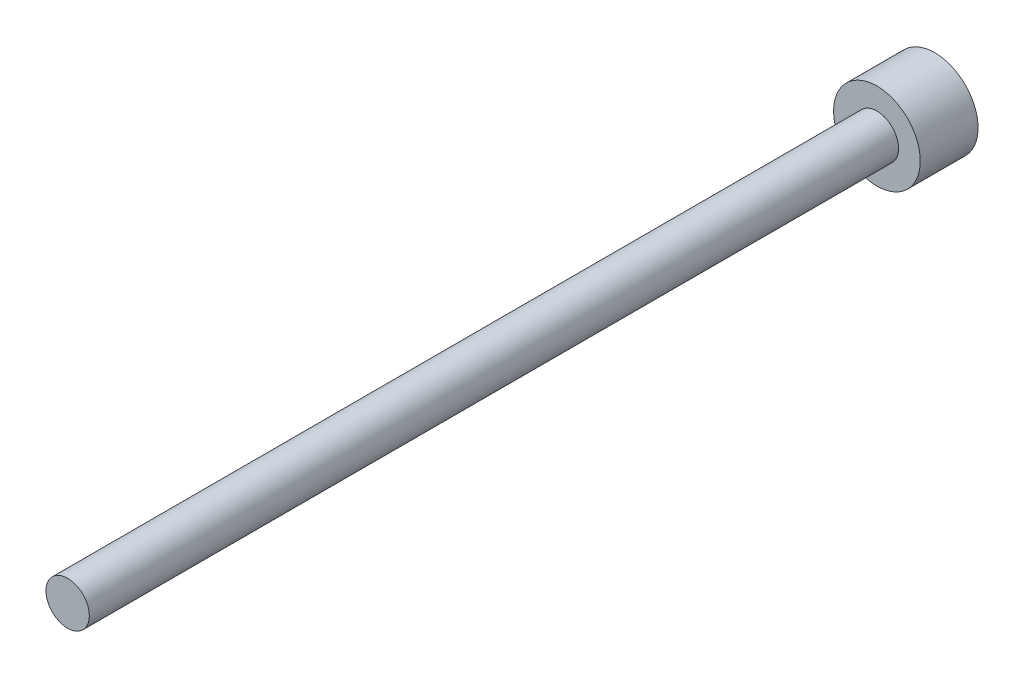
ISO-10303-21;
HEADER;
FILE_DESCRIPTION(('STEP AP214'),'2;1');
FILE_NAME('part.step','',(''),(''),'','','');
FILE_SCHEMA(('AUTOMOTIVE_DESIGN { 1 0 10303 214 1 1 1 1 }'));
ENDSEC;
DATA;
#1=APPLICATION_CONTEXT('core data for automotive mechanical design processes');
#2=APPLICATION_PROTOCOL_DEFINITION('international standard','automotive_design',2000,#1);
#3=PRODUCT_CONTEXT('',#1,'mechanical');
#4=PRODUCT('Part','Part','',(#3));
#5=PRODUCT_RELATED_PRODUCT_CATEGORY('part','',(#4));
#6=PRODUCT_DEFINITION_FORMATION('','',#4);
#7=PRODUCT_DEFINITION_CONTEXT('part definition',#1,'design');
#8=PRODUCT_DEFINITION('design','',#6,#7);
#9=PRODUCT_DEFINITION_SHAPE('','',#8);
#10=(LENGTH_UNIT() NAMED_UNIT(*) SI_UNIT(.MILLI.,.METRE.));
#11=(NAMED_UNIT(*) PLANE_ANGLE_UNIT() SI_UNIT($,.RADIAN.));
#12=(NAMED_UNIT(*) SI_UNIT($,.STERADIAN.) SOLID_ANGLE_UNIT());
#13=UNCERTAINTY_MEASURE_WITH_UNIT(LENGTH_MEASURE(1.E-05),#10,'distance_accuracy_value','');
#14=(GEOMETRIC_REPRESENTATION_CONTEXT(3) GLOBAL_UNCERTAINTY_ASSIGNED_CONTEXT((#13)) GLOBAL_UNIT_ASSIGNED_CONTEXT((#10,
#11,#12)) REPRESENTATION_CONTEXT('',''));
#15=CARTESIAN_POINT('',(0.,0.,0.));
#16=DIRECTION('',(0.,0.,1.));
#17=DIRECTION('',(1.,0.,0.));
#18=AXIS2_PLACEMENT_3D('',#15,#16,#17);
#19=CARTESIAN_POINT('',(0.,0.,88.9));
#20=DIRECTION('',(0.,0.,-1.));
#21=DIRECTION('',(-1.,0.,0.));
#22=AXIS2_PLACEMENT_3D('',#19,#20,#21);
#23=CYLINDRICAL_SURFACE('',#22,2.38125);
#24=CARTESIAN_POINT('',(0.,0.,88.9));
#25=DIRECTION('',(0.,0.,1.));
#26=DIRECTION('',(1.,0.,0.));
#27=AXIS2_PLACEMENT_3D('',#24,#25,#26);
#28=CIRCLE('',#27,2.38125);
#29=CARTESIAN_POINT('',(2.38125,0.,88.9));
#30=VERTEX_POINT('',#29);
#31=EDGE_CURVE('E10',#30,#30,#28,.T.);
#32=ORIENTED_EDGE('',*,*,#31,.F.);
#33=EDGE_LOOP('',(#32));
#34=FACE_BOUND('',#33,.T.);
#35=CARTESIAN_POINT('',(0.,0.,0.));
#36=DIRECTION('',(0.,0.,1.));
#37=DIRECTION('',(1.,0.,0.));
#38=AXIS2_PLACEMENT_3D('',#35,#36,#37);
#39=CIRCLE('',#38,2.38125);
#40=CARTESIAN_POINT('',(2.38125,0.,0.));
#41=VERTEX_POINT('',#40);
#42=EDGE_CURVE('E38',#41,#41,#39,.T.);
#43=ORIENTED_EDGE('',*,*,#42,.T.);
#44=EDGE_LOOP('',(#43));
#45=FACE_BOUND('',#44,.T.);
#46=ADVANCED_FACE('F35',(#34,#45),#23,.T.);
#47=CARTESIAN_POINT('',(0.,0.,88.9));
#48=DIRECTION('',(0.,0.,1.));
#49=DIRECTION('',(1.,0.,0.));
#50=AXIS2_PLACEMENT_3D('',#47,#48,#49);
#51=PLANE('',#50);
#52=ORIENTED_EDGE('',*,*,#31,.T.);
#53=EDGE_LOOP('',(#52));
#54=FACE_BOUND('',#53,.T.);
#55=ADVANCED_FACE('F58',(#54),#51,.T.);
#56=CARTESIAN_POINT('',(0.,0.,-6.35));
#57=DIRECTION('',(0.,0.,1.));
#58=DIRECTION('',(1.,0.,0.));
#59=AXIS2_PLACEMENT_3D('',#56,#57,#58);
#60=CYLINDRICAL_SURFACE('',#59,4.7625);
#61=CARTESIAN_POINT('',(0.,0.,-6.35));
#62=DIRECTION('',(0.,0.,-1.));
#63=DIRECTION('',(-1.,0.,0.));
#64=AXIS2_PLACEMENT_3D('',#61,#62,#63);
#65=CIRCLE('',#64,4.7625);
#66=CARTESIAN_POINT('',(-4.7625,0.,-6.35));
#67=VERTEX_POINT('',#66);
#68=EDGE_CURVE('E45',#67,#67,#65,.T.);
#69=ORIENTED_EDGE('',*,*,#68,.F.);
#70=EDGE_LOOP('',(#69));
#71=FACE_BOUND('',#70,.T.);
#72=CARTESIAN_POINT('',(0.,0.,0.));
#73=DIRECTION('',(0.,0.,-1.));
#74=DIRECTION('',(-1.,0.,0.));
#75=AXIS2_PLACEMENT_3D('',#72,#73,#74);
#76=CIRCLE('',#75,4.7625);
#77=CARTESIAN_POINT('',(-4.7625,0.,0.));
#78=VERTEX_POINT('',#77);
#79=EDGE_CURVE('E47',#78,#78,#76,.T.);
#80=ORIENTED_EDGE('',*,*,#79,.T.);
#81=EDGE_LOOP('',(#80));
#82=FACE_BOUND('',#81,.T.);
#83=ADVANCED_FACE('F55',(#71,#82),#60,.T.);
#84=CARTESIAN_POINT('',(0.,0.,-6.35));
#85=DIRECTION('',(0.,0.,-1.));
#86=DIRECTION('',(-1.,0.,0.));
#87=AXIS2_PLACEMENT_3D('',#84,#85,#86);
#88=PLANE('',#87);
#89=ORIENTED_EDGE('',*,*,#68,.T.);
#90=EDGE_LOOP('',(#89));
#91=FACE_BOUND('',#90,.T.);
#92=ADVANCED_FACE('F53',(#91),#88,.T.);
#93=CARTESIAN_POINT('',(0.,0.,0.));
#94=DIRECTION('',(0.,0.,-1.));
#95=DIRECTION('',(-1.,0.,0.));
#96=AXIS2_PLACEMENT_3D('',#93,#94,#95);
#97=PLANE('',#96);
#98=ORIENTED_EDGE('',*,*,#42,.F.);
#99=EDGE_LOOP('',(#98));
#100=FACE_BOUND('',#99,.T.);
#101=ORIENTED_EDGE('',*,*,#79,.F.);
#102=EDGE_LOOP('',(#101));
#103=FACE_BOUND('',#102,.T.);
#104=ADVANCED_FACE('F62',(#100,#103),#97,.F.);
#105=CLOSED_SHELL('',(#46,#55,#83,#92,#104));
#106=MANIFOLD_SOLID_BREP('B2',#105);
#107=ADVANCED_BREP_SHAPE_REPRESENTATION('',(#18,#106),#14);
#108=SHAPE_DEFINITION_REPRESENTATION(#9,#107);
ENDSEC;
END-ISO-10303-21;
